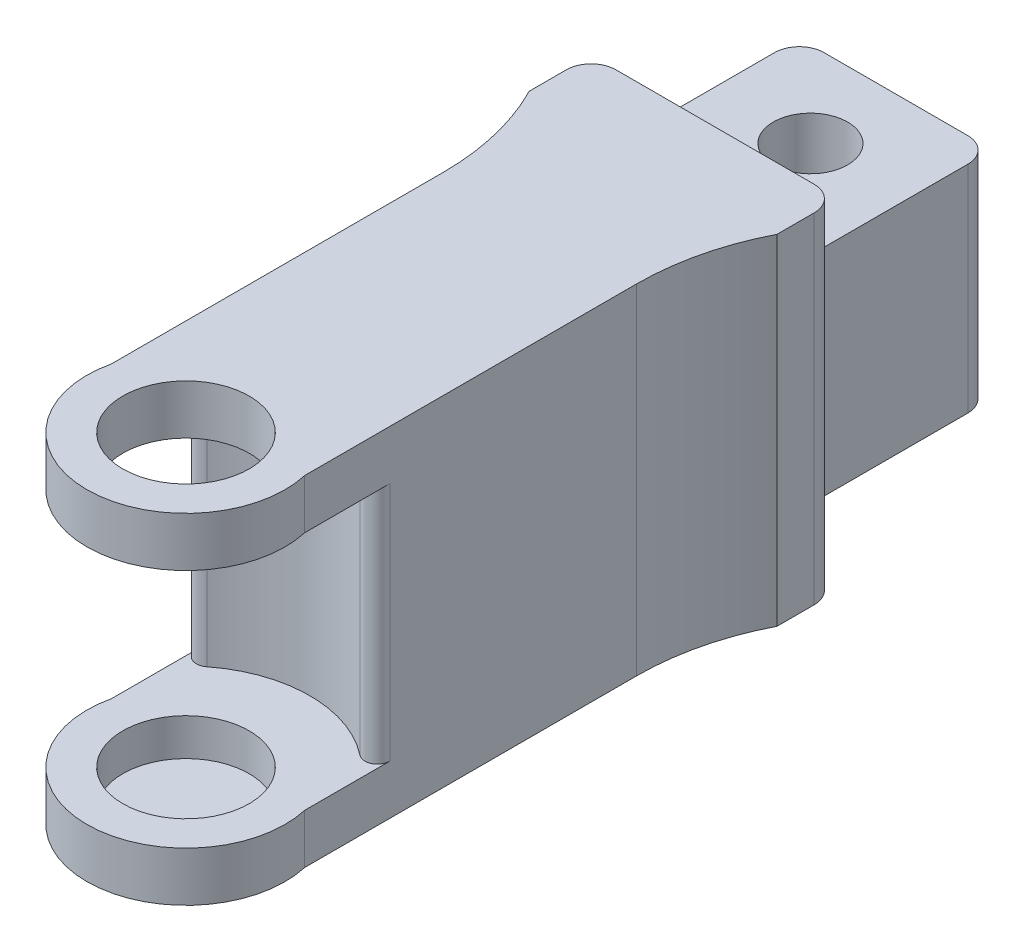
ISO-10303-21;
HEADER;
FILE_DESCRIPTION(('STEP AP214'),'2;1');
FILE_NAME('part.step','',(''),(''),'','','');
FILE_SCHEMA(('AUTOMOTIVE_DESIGN { 1 0 10303 214 1 1 1 1 }'));
ENDSEC;
DATA;
#1=APPLICATION_CONTEXT('core data for automotive mechanical design processes');
#2=APPLICATION_PROTOCOL_DEFINITION('international standard','automotive_design',2000,#1);
#3=PRODUCT_CONTEXT('',#1,'mechanical');
#4=PRODUCT('Part','Part','',(#3));
#5=PRODUCT_RELATED_PRODUCT_CATEGORY('part','',(#4));
#6=PRODUCT_DEFINITION_FORMATION('','',#4);
#7=PRODUCT_DEFINITION_CONTEXT('part definition',#1,'design');
#8=PRODUCT_DEFINITION('design','',#6,#7);
#9=PRODUCT_DEFINITION_SHAPE('','',#8);
#10=(LENGTH_UNIT() NAMED_UNIT(*) SI_UNIT(.MILLI.,.METRE.));
#11=(NAMED_UNIT(*) PLANE_ANGLE_UNIT() SI_UNIT($,.RADIAN.));
#12=(NAMED_UNIT(*) SI_UNIT($,.STERADIAN.) SOLID_ANGLE_UNIT());
#13=UNCERTAINTY_MEASURE_WITH_UNIT(LENGTH_MEASURE(1.E-05),#10,'distance_accuracy_value','');
#14=(GEOMETRIC_REPRESENTATION_CONTEXT(3) GLOBAL_UNCERTAINTY_ASSIGNED_CONTEXT((#13)) GLOBAL_UNIT_ASSIGNED_CONTEXT((#10,
#11,#12)) REPRESENTATION_CONTEXT('',''));
#15=CARTESIAN_POINT('',(0.,0.,0.));
#16=DIRECTION('',(0.,0.,1.));
#17=DIRECTION('',(1.,0.,0.));
#18=AXIS2_PLACEMENT_3D('',#15,#16,#17);
#19=CARTESIAN_POINT('',(-3.9,8.7,0.));
#20=DIRECTION('',(1.,0.,0.));
#21=DIRECTION('',(0.,0.,-1.));
#22=AXIS2_PLACEMENT_3D('',#19,#20,#21);
#23=PLANE('',#22);
#24=DIRECTION('',(0.,0.,1.));
#25=VECTOR('',#24,1.);
#26=CARTESIAN_POINT('',(-3.9,-0.5,0.));
#27=LINE('',#26,#25);
#28=CARTESIAN_POINT('',(-3.9,-0.5,20.6768067357565));
#29=VERTEX_POINT('',#28);
#30=CARTESIAN_POINT('',(-3.9,-0.5,24.1111805582684));
#31=VERTEX_POINT('',#30);
#32=EDGE_CURVE('E220',#29,#31,#27,.T.);
#33=ORIENTED_EDGE('',*,*,#32,.F.);
#34=DIRECTION('',(0.,1.,0.));
#35=VECTOR('',#34,1.);
#36=CARTESIAN_POINT('',(-3.9,9.2,20.6768067357565));
#37=LINE('',#36,#35);
#38=CARTESIAN_POINT('',(-3.9,9.2,20.6768067357565));
#39=VERTEX_POINT('',#38);
#40=EDGE_CURVE('E325',#29,#39,#37,.T.);
#41=ORIENTED_EDGE('',*,*,#40,.T.);
#42=DIRECTION('',(0.,0.,1.));
#43=VECTOR('',#42,1.);
#44=CARTESIAN_POINT('',(-3.9,9.2,0.));
#45=LINE('',#44,#43);
#46=CARTESIAN_POINT('',(-3.9,9.2,24.1111805582684));
#47=VERTEX_POINT('',#46);
#48=EDGE_CURVE('E397',#39,#47,#45,.T.);
#49=ORIENTED_EDGE('',*,*,#48,.T.);
#50=DIRECTION('',(0.,-1.,0.));
#51=VECTOR('',#50,1.);
#52=CARTESIAN_POINT('',(-3.9,11.2,24.1111805582684));
#53=LINE('',#52,#51);
#54=CARTESIAN_POINT('',(-3.9,11.2,24.1111805582684));
#55=VERTEX_POINT('',#54);
#56=EDGE_CURVE('E271',#55,#47,#53,.T.);
#57=ORIENTED_EDGE('',*,*,#56,.F.);
#58=DIRECTION('',(0.,0.,1.));
#59=VECTOR('',#58,1.);
#60=CARTESIAN_POINT('',(-3.9,11.2,0.));
#61=LINE('',#60,#59);
#62=CARTESIAN_POINT('',(-3.9,11.2,10.7096052460712));
#63=VERTEX_POINT('',#62);
#64=EDGE_CURVE('E252',#63,#55,#61,.T.);
#65=ORIENTED_EDGE('',*,*,#64,.F.);
#66=DIRECTION('',(0.,1.,0.));
#67=VECTOR('',#66,1.);
#68=CARTESIAN_POINT('',(-3.9,8.7,10.7096052460712));
#69=LINE('',#68,#67);
#70=CARTESIAN_POINT('',(-3.9,-2.5,10.7096052460712));
#71=VERTEX_POINT('',#70);
#72=EDGE_CURVE('E305',#63,#71,#69,.F.);
#73=ORIENTED_EDGE('',*,*,#72,.T.);
#74=DIRECTION('',(0.,0.,1.));
#75=VECTOR('',#74,1.);
#76=CARTESIAN_POINT('',(-3.9,-2.5,0.));
#77=LINE('',#76,#75);
#78=CARTESIAN_POINT('',(-3.9,-2.5,24.1111805582684));
#79=VERTEX_POINT('',#78);
#80=EDGE_CURVE('E395',#71,#79,#77,.T.);
#81=ORIENTED_EDGE('',*,*,#80,.T.);
#82=DIRECTION('',(0.,1.,0.));
#83=VECTOR('',#82,1.);
#84=CARTESIAN_POINT('',(-3.9,-2.5,24.1111805582684));
#85=LINE('',#84,#83);
#86=EDGE_CURVE('E241',#79,#31,#85,.T.);
#87=ORIENTED_EDGE('',*,*,#86,.T.);
#88=EDGE_LOOP('',(#33,#41,#49,#57,#65,#73,#81,#87));
#89=FACE_BOUND('',#88,.T.);
#90=ADVANCED_FACE('F65',(#89),#23,.F.);
#91=CARTESIAN_POINT('',(3.9,8.7,0.));
#92=DIRECTION('',(1.,0.,0.));
#93=DIRECTION('',(0.,0.,-1.));
#94=AXIS2_PLACEMENT_3D('',#91,#92,#93);
#95=PLANE('',#94);
#96=DIRECTION('',(0.,-1.,0.));
#97=VECTOR('',#96,1.);
#98=CARTESIAN_POINT('',(3.9,8.7,20.6768067357565));
#99=LINE('',#98,#97);
#100=CARTESIAN_POINT('',(3.9,9.2,20.6768067357565));
#101=VERTEX_POINT('',#100);
#102=CARTESIAN_POINT('',(3.9,-0.5,20.6768067357565));
#103=VERTEX_POINT('',#102);
#104=EDGE_CURVE('E235',#101,#103,#99,.T.);
#105=ORIENTED_EDGE('',*,*,#104,.T.);
#106=DIRECTION('',(0.,0.,1.));
#107=VECTOR('',#106,1.);
#108=CARTESIAN_POINT('',(3.9,-0.5,0.));
#109=LINE('',#108,#107);
#110=CARTESIAN_POINT('',(3.9,-0.5,24.1111805582685));
#111=VERTEX_POINT('',#110);
#112=EDGE_CURVE('E217',#103,#111,#109,.T.);
#113=ORIENTED_EDGE('',*,*,#112,.T.);
#114=DIRECTION('',(0.,1.,0.));
#115=VECTOR('',#114,1.);
#116=CARTESIAN_POINT('',(3.9,-2.5,24.1111805582685));
#117=LINE('',#116,#115);
#118=CARTESIAN_POINT('',(3.9,-2.5,24.1111805582685));
#119=VERTEX_POINT('',#118);
#120=EDGE_CURVE('E232',#119,#111,#117,.T.);
#121=ORIENTED_EDGE('',*,*,#120,.F.);
#122=DIRECTION('',(0.,0.,1.));
#123=VECTOR('',#122,1.);
#124=CARTESIAN_POINT('',(3.9,-2.5,0.));
#125=LINE('',#124,#123);
#126=CARTESIAN_POINT('',(3.9,-2.5,10.7096052460712));
#127=VERTEX_POINT('',#126);
#128=EDGE_CURVE('E390',#127,#119,#125,.T.);
#129=ORIENTED_EDGE('',*,*,#128,.F.);
#130=DIRECTION('',(0.,-1.,0.));
#131=VECTOR('',#130,1.);
#132=CARTESIAN_POINT('',(3.9,11.2,10.7096052460712));
#133=LINE('',#132,#131);
#134=CARTESIAN_POINT('',(3.9,11.2,10.7096052460712));
#135=VERTEX_POINT('',#134);
#136=EDGE_CURVE('E308',#127,#135,#133,.F.);
#137=ORIENTED_EDGE('',*,*,#136,.T.);
#138=DIRECTION('',(0.,0.,-1.));
#139=VECTOR('',#138,1.);
#140=CARTESIAN_POINT('',(3.9,11.2,0.));
#141=LINE('',#140,#139);
#142=CARTESIAN_POINT('',(3.9,11.2,24.1111805582684));
#143=VERTEX_POINT('',#142);
#144=EDGE_CURVE('E256',#143,#135,#141,.T.);
#145=ORIENTED_EDGE('',*,*,#144,.F.);
#146=DIRECTION('',(0.,-1.,0.));
#147=VECTOR('',#146,1.);
#148=CARTESIAN_POINT('',(3.9,11.2,24.1111805582684));
#149=LINE('',#148,#147);
#150=CARTESIAN_POINT('',(3.9,9.2,24.1111805582684));
#151=VERTEX_POINT('',#150);
#152=EDGE_CURVE('E264',#143,#151,#149,.T.);
#153=ORIENTED_EDGE('',*,*,#152,.T.);
#154=DIRECTION('',(0.,0.,1.));
#155=VECTOR('',#154,1.);
#156=CARTESIAN_POINT('',(3.9,9.2,0.));
#157=LINE('',#156,#155);
#158=EDGE_CURVE('E400',#101,#151,#157,.T.);
#159=ORIENTED_EDGE('',*,*,#158,.F.);
#160=EDGE_LOOP('',(#105,#113,#121,#129,#137,#145,#153,#159));
#161=FACE_BOUND('',#160,.T.);
#162=ADVANCED_FACE('F230',(#161),#95,.T.);
#163=CARTESIAN_POINT('',(0.,-2.5,25.));
#164=DIRECTION('',(0.,1.,0.));
#165=DIRECTION('',(0.,0.,1.));
#166=AXIS2_PLACEMENT_3D('',#163,#164,#165);
#167=CYLINDRICAL_SURFACE('',#166,4.);
#168=ORIENTED_EDGE('',*,*,#120,.T.);
#169=CARTESIAN_POINT('',(0.,-0.5,25.));
#170=DIRECTION('',(0.,1.,0.));
#171=DIRECTION('',(0.,0.,1.));
#172=AXIS2_PLACEMENT_3D('',#169,#170,#171);
#173=CIRCLE('',#172,4.);
#174=EDGE_CURVE('E214',#111,#31,#173,.F.);
#175=ORIENTED_EDGE('',*,*,#174,.T.);
#176=ORIENTED_EDGE('',*,*,#86,.F.);
#177=CARTESIAN_POINT('',(0.,-2.5,25.));
#178=DIRECTION('',(0.,1.,0.));
#179=DIRECTION('',(0.,0.,1.));
#180=AXIS2_PLACEMENT_3D('',#177,#178,#179);
#181=CIRCLE('',#180,4.);
#182=EDGE_CURVE('E239',#79,#119,#181,.T.);
#183=ORIENTED_EDGE('',*,*,#182,.T.);
#184=EDGE_LOOP('',(#168,#175,#176,#183));
#185=FACE_BOUND('',#184,.T.);
#186=ADVANCED_FACE('F237',(#185),#167,.T.);
#187=CARTESIAN_POINT('',(0.,-2.5,25.));
#188=DIRECTION('',(0.,1.,0.));
#189=DIRECTION('',(0.,0.,1.));
#190=AXIS2_PLACEMENT_3D('',#187,#188,#189);
#191=CYLINDRICAL_SURFACE('',#190,2.55);
#192=CARTESIAN_POINT('',(0.,-2.,25.));
#193=DIRECTION('',(0.,1.,0.));
#194=DIRECTION('',(0.,0.,1.));
#195=AXIS2_PLACEMENT_3D('',#192,#193,#194);
#196=CIRCLE('',#195,2.55);
#197=CARTESIAN_POINT('',(0.,-2.,27.55));
#198=VERTEX_POINT('',#197);
#199=EDGE_CURVE('E410',#198,#198,#196,.T.);
#200=ORIENTED_EDGE('',*,*,#199,.F.);
#201=EDGE_LOOP('',(#200));
#202=FACE_BOUND('',#201,.T.);
#203=CARTESIAN_POINT('',(0.,-0.5,25.));
#204=DIRECTION('',(0.,1.,0.));
#205=DIRECTION('',(0.,0.,1.));
#206=AXIS2_PLACEMENT_3D('',#203,#204,#205);
#207=CIRCLE('',#206,2.55);
#208=CARTESIAN_POINT('',(0.,-0.5,27.55));
#209=VERTEX_POINT('',#208);
#210=EDGE_CURVE('E413',#209,#209,#207,.T.);
#211=ORIENTED_EDGE('',*,*,#210,.T.);
#212=EDGE_LOOP('',(#211));
#213=FACE_BOUND('',#212,.T.);
#214=ADVANCED_FACE('F423',(#202,#213),#191,.F.);
#215=CARTESIAN_POINT('',(0.,0.,0.));
#216=DIRECTION('',(0.,1.,0.));
#217=DIRECTION('',(0.,0.,1.));
#218=AXIS2_PLACEMENT_3D('',#215,#216,#217);
#219=PLANE('',#218);
#220=CARTESIAN_POINT('',(0.,0.,-0.200000000000001));
#221=DIRECTION('',(0.,1.,0.));
#222=DIRECTION('',(0.,0.,1.));
#223=AXIS2_PLACEMENT_3D('',#220,#221,#222);
#224=CIRCLE('',#223,1.5);
#225=CARTESIAN_POINT('',(0.,0.,1.3));
#226=VERTEX_POINT('',#225);
#227=EDGE_CURVE('E274',#226,#226,#224,.T.);
#228=ORIENTED_EDGE('',*,*,#227,.T.);
#229=EDGE_LOOP('',(#228));
#230=FACE_BOUND('',#229,.T.);
#231=DIRECTION('',(1.,0.,0.));
#232=VECTOR('',#231,1.);
#233=CARTESIAN_POINT('',(0.,0.,-3.65));
#234=LINE('',#233,#232);
#235=CARTESIAN_POINT('',(-2.9,0.,-3.65));
#236=VERTEX_POINT('',#235);
#237=CARTESIAN_POINT('',(2.9,0.,-3.65));
#238=VERTEX_POINT('',#237);
#239=EDGE_CURVE('E291',#236,#238,#234,.T.);
#240=ORIENTED_EDGE('',*,*,#239,.T.);
#241=CARTESIAN_POINT('',(2.9,0.,-2.65));
#242=DIRECTION('',(0.,1.,0.));
#243=DIRECTION('',(0.,0.,1.));
#244=AXIS2_PLACEMENT_3D('',#241,#242,#243);
#245=CIRCLE('',#244,1.);
#246=CARTESIAN_POINT('',(3.9,0.,-2.65));
#247=VERTEX_POINT('',#246);
#248=EDGE_CURVE('E344',#238,#247,#245,.F.);
#249=ORIENTED_EDGE('',*,*,#248,.T.);
#250=DIRECTION('',(0.,0.,1.));
#251=VECTOR('',#250,1.);
#252=CARTESIAN_POINT('',(3.9,0.,0.));
#253=LINE('',#252,#251);
#254=CARTESIAN_POINT('',(3.9,0.,3.65));
#255=VERTEX_POINT('',#254);
#256=EDGE_CURVE('E289',#247,#255,#253,.T.);
#257=ORIENTED_EDGE('',*,*,#256,.T.);
#258=DIRECTION('',(1.,0.,0.));
#259=VECTOR('',#258,1.);
#260=CARTESIAN_POINT('',(0.,0.,3.65));
#261=LINE('',#260,#259);
#262=CARTESIAN_POINT('',(-3.9,0.,3.65));
#263=VERTEX_POINT('',#262);
#264=EDGE_CURVE('E248',#263,#255,#261,.T.);
#265=ORIENTED_EDGE('',*,*,#264,.F.);
#266=DIRECTION('',(0.,0.,1.));
#267=VECTOR('',#266,1.);
#268=CARTESIAN_POINT('',(-3.9,0.,0.));
#269=LINE('',#268,#267);
#270=CARTESIAN_POINT('',(-3.9,0.,-2.65));
#271=VERTEX_POINT('',#270);
#272=EDGE_CURVE('E279',#271,#263,#269,.T.);
#273=ORIENTED_EDGE('',*,*,#272,.F.);
#274=CARTESIAN_POINT('',(-2.9,0.,-2.65));
#275=DIRECTION('',(0.,1.,0.));
#276=DIRECTION('',(0.,0.,1.));
#277=AXIS2_PLACEMENT_3D('',#274,#275,#276);
#278=CIRCLE('',#277,1.);
#279=EDGE_CURVE('E342',#271,#236,#278,.F.);
#280=ORIENTED_EDGE('',*,*,#279,.T.);
#281=EDGE_LOOP('',(#240,#249,#257,#265,#273,#280));
#282=FACE_BOUND('',#281,.T.);
#283=ADVANCED_FACE('F426',(#230,#282),#219,.F.);
#284=CARTESIAN_POINT('',(0.,8.7,0.));
#285=DIRECTION('',(0.,1.,0.));
#286=DIRECTION('',(0.,0.,1.));
#287=AXIS2_PLACEMENT_3D('',#284,#285,#286);
#288=PLANE('',#287);
#289=CARTESIAN_POINT('',(0.,8.7,-0.200000000000001));
#290=DIRECTION('',(0.,1.,0.));
#291=DIRECTION('',(0.,0.,1.));
#292=AXIS2_PLACEMENT_3D('',#289,#290,#291);
#293=CIRCLE('',#292,1.5);
#294=CARTESIAN_POINT('',(0.,8.7,1.3));
#295=VERTEX_POINT('',#294);
#296=EDGE_CURVE('E275',#295,#295,#293,.T.);
#297=ORIENTED_EDGE('',*,*,#296,.F.);
#298=EDGE_LOOP('',(#297));
#299=FACE_BOUND('',#298,.T.);
#300=DIRECTION('',(0.,0.,1.));
#301=VECTOR('',#300,1.);
#302=CARTESIAN_POINT('',(3.9,8.7,0.));
#303=LINE('',#302,#301);
#304=CARTESIAN_POINT('',(3.9,8.7,-2.65));
#305=VERTEX_POINT('',#304);
#306=CARTESIAN_POINT('',(3.9,8.7,3.65));
#307=VERTEX_POINT('',#306);
#308=EDGE_CURVE('E278',#305,#307,#303,.T.);
#309=ORIENTED_EDGE('',*,*,#308,.F.);
#310=CARTESIAN_POINT('',(2.9,8.7,-2.65));
#311=DIRECTION('',(0.,1.,0.));
#312=DIRECTION('',(0.,0.,1.));
#313=AXIS2_PLACEMENT_3D('',#310,#311,#312);
#314=CIRCLE('',#313,1.);
#315=CARTESIAN_POINT('',(2.9,8.7,-3.65));
#316=VERTEX_POINT('',#315);
#317=EDGE_CURVE('E350',#305,#316,#314,.T.);
#318=ORIENTED_EDGE('',*,*,#317,.T.);
#319=DIRECTION('',(1.,0.,0.));
#320=VECTOR('',#319,1.);
#321=CARTESIAN_POINT('',(0.,8.7,-3.65));
#322=LINE('',#321,#320);
#323=CARTESIAN_POINT('',(-2.9,8.7,-3.65));
#324=VERTEX_POINT('',#323);
#325=EDGE_CURVE('E281',#324,#316,#322,.T.);
#326=ORIENTED_EDGE('',*,*,#325,.F.);
#327=CARTESIAN_POINT('',(-2.9,8.7,-2.65));
#328=DIRECTION('',(0.,1.,0.));
#329=DIRECTION('',(0.,0.,1.));
#330=AXIS2_PLACEMENT_3D('',#327,#328,#329);
#331=CIRCLE('',#330,1.);
#332=CARTESIAN_POINT('',(-3.9,8.7,-2.65));
#333=VERTEX_POINT('',#332);
#334=EDGE_CURVE('E348',#324,#333,#331,.T.);
#335=ORIENTED_EDGE('',*,*,#334,.T.);
#336=DIRECTION('',(0.,0.,1.));
#337=VECTOR('',#336,1.);
#338=CARTESIAN_POINT('',(-3.9,8.7,0.));
#339=LINE('',#338,#337);
#340=CARTESIAN_POINT('',(-3.9,8.7,3.65));
#341=VERTEX_POINT('',#340);
#342=EDGE_CURVE('E284',#333,#341,#339,.T.);
#343=ORIENTED_EDGE('',*,*,#342,.T.);
#344=DIRECTION('',(1.,0.,0.));
#345=VECTOR('',#344,1.);
#346=CARTESIAN_POINT('',(0.,8.7,3.65));
#347=LINE('',#346,#345);
#348=EDGE_CURVE('E265',#341,#307,#347,.T.);
#349=ORIENTED_EDGE('',*,*,#348,.T.);
#350=EDGE_LOOP('',(#309,#318,#326,#335,#343,#349));
#351=FACE_BOUND('',#350,.T.);
#352=ADVANCED_FACE('F464',(#299,#351),#288,.T.);
#353=CARTESIAN_POINT('',(3.9,8.7,0.));
#354=DIRECTION('',(1.,0.,0.));
#355=DIRECTION('',(0.,0.,-1.));
#356=AXIS2_PLACEMENT_3D('',#353,#354,#355);
#357=PLANE('',#356);
#358=ORIENTED_EDGE('',*,*,#256,.F.);
#359=DIRECTION('',(0.,-1.,0.));
#360=VECTOR('',#359,1.);
#361=CARTESIAN_POINT('',(3.9,8.7,-2.65));
#362=LINE('',#361,#360);
#363=EDGE_CURVE('E346',#247,#305,#362,.F.);
#364=ORIENTED_EDGE('',*,*,#363,.T.);
#365=ORIENTED_EDGE('',*,*,#308,.T.);
#366=DIRECTION('',(0.,-1.,0.));
#367=VECTOR('',#366,1.);
#368=CARTESIAN_POINT('',(3.9,8.7,3.65));
#369=LINE('',#368,#367);
#370=EDGE_CURVE('E286',#307,#255,#369,.T.);
#371=ORIENTED_EDGE('',*,*,#370,.T.);
#372=EDGE_LOOP('',(#358,#364,#365,#371));
#373=FACE_BOUND('',#372,.T.);
#374=ADVANCED_FACE('F460',(#373),#357,.T.);
#375=CARTESIAN_POINT('',(0.,8.7,-3.65));
#376=DIRECTION('',(0.,0.,-1.));
#377=DIRECTION('',(-1.,0.,0.));
#378=AXIS2_PLACEMENT_3D('',#375,#376,#377);
#379=PLANE('',#378);
#380=ORIENTED_EDGE('',*,*,#325,.T.);
#381=DIRECTION('',(0.,-1.,0.));
#382=VECTOR('',#381,1.);
#383=CARTESIAN_POINT('',(2.9,8.7,-3.65));
#384=LINE('',#383,#382);
#385=EDGE_CURVE('E339',#316,#238,#384,.T.);
#386=ORIENTED_EDGE('',*,*,#385,.T.);
#387=ORIENTED_EDGE('',*,*,#239,.F.);
#388=DIRECTION('',(0.,-1.,0.));
#389=VECTOR('',#388,1.);
#390=CARTESIAN_POINT('',(-2.9,8.7,-3.65));
#391=LINE('',#390,#389);
#392=EDGE_CURVE('E337',#236,#324,#391,.F.);
#393=ORIENTED_EDGE('',*,*,#392,.T.);
#394=EDGE_LOOP('',(#380,#386,#387,#393));
#395=FACE_BOUND('',#394,.T.);
#396=ADVANCED_FACE('F456',(#395),#379,.T.);
#397=CARTESIAN_POINT('',(-3.9,8.7,0.));
#398=DIRECTION('',(1.,0.,0.));
#399=DIRECTION('',(0.,0.,-1.));
#400=AXIS2_PLACEMENT_3D('',#397,#398,#399);
#401=PLANE('',#400);
#402=ORIENTED_EDGE('',*,*,#342,.F.);
#403=DIRECTION('',(0.,-1.,0.));
#404=VECTOR('',#403,1.);
#405=CARTESIAN_POINT('',(-3.9,0.,-2.65));
#406=LINE('',#405,#404);
#407=EDGE_CURVE('E352',#333,#271,#406,.T.);
#408=ORIENTED_EDGE('',*,*,#407,.T.);
#409=ORIENTED_EDGE('',*,*,#272,.T.);
#410=DIRECTION('',(0.,-1.,0.));
#411=VECTOR('',#410,1.);
#412=CARTESIAN_POINT('',(-3.9,8.7,3.65));
#413=LINE('',#412,#411);
#414=EDGE_CURVE('E268',#341,#263,#413,.T.);
#415=ORIENTED_EDGE('',*,*,#414,.F.);
#416=EDGE_LOOP('',(#402,#408,#409,#415));
#417=FACE_BOUND('',#416,.T.);
#418=ADVANCED_FACE('F453',(#417),#401,.F.);
#419=CARTESIAN_POINT('',(-5.,8.7,0.));
#420=DIRECTION('',(-1.,0.,0.));
#421=DIRECTION('',(0.,0.,1.));
#422=AXIS2_PLACEMENT_3D('',#419,#420,#421);
#423=PLANE('',#422);
#424=DIRECTION('',(0.,0.,1.));
#425=VECTOR('',#424,1.);
#426=CARTESIAN_POINT('',(-5.,11.2,0.));
#427=LINE('',#426,#425);
#428=CARTESIAN_POINT('',(-5.,11.2,4.65));
#429=VERTEX_POINT('',#428);
#430=CARTESIAN_POINT('',(-5.,11.2,6.15));
#431=VERTEX_POINT('',#430);
#432=EDGE_CURVE('E243',#429,#431,#427,.T.);
#433=ORIENTED_EDGE('',*,*,#432,.F.);
#434=DIRECTION('',(0.,-1.,0.));
#435=VECTOR('',#434,1.);
#436=CARTESIAN_POINT('',(-5.,8.7,4.65));
#437=LINE('',#436,#435);
#438=CARTESIAN_POINT('',(-5.,-2.5,4.65));
#439=VERTEX_POINT('',#438);
#440=EDGE_CURVE('E355',#429,#439,#437,.T.);
#441=ORIENTED_EDGE('',*,*,#440,.T.);
#442=DIRECTION('',(0.,0.,1.));
#443=VECTOR('',#442,1.);
#444=CARTESIAN_POINT('',(-5.,-2.5,0.));
#445=LINE('',#444,#443);
#446=CARTESIAN_POINT('',(-5.,-2.5,6.15));
#447=VERTEX_POINT('',#446);
#448=EDGE_CURVE('E245',#439,#447,#445,.T.);
#449=ORIENTED_EDGE('',*,*,#448,.T.);
#450=DIRECTION('',(0.,-1.,0.));
#451=VECTOR('',#450,1.);
#452=CARTESIAN_POINT('',(-5.,8.7,6.15));
#453=LINE('',#452,#451);
#454=EDGE_CURVE('E300',#431,#447,#453,.T.);
#455=ORIENTED_EDGE('',*,*,#454,.F.);
#456=EDGE_LOOP('',(#433,#441,#449,#455));
#457=FACE_BOUND('',#456,.T.);
#458=ADVANCED_FACE('F376',(#457),#423,.T.);
#459=CARTESIAN_POINT('',(0.,8.7,25.));
#460=DIRECTION('',(0.,-1.,0.));
#461=DIRECTION('',(0.,0.,-1.));
#462=AXIS2_PLACEMENT_3D('',#459,#460,#461);
#463=CYLINDRICAL_SURFACE('',#462,5.);
#464=CARTESIAN_POINT('',(0.,-0.5,25.));
#465=DIRECTION('',(0.,1.,0.));
#466=DIRECTION('',(0.,0.,1.));
#467=AXIS2_PLACEMENT_3D('',#464,#465,#466);
#468=CIRCLE('',#467,5.);
#469=CARTESIAN_POINT('',(3.09090909090909,-0.5,21.0698243052332));
#470=VERTEX_POINT('',#469);
#471=CARTESIAN_POINT('',(-3.09090909090909,-0.5,21.0698243052332));
#472=VERTEX_POINT('',#471);
#473=EDGE_CURVE('E409',#470,#472,#468,.T.);
#474=ORIENTED_EDGE('',*,*,#473,.F.);
#475=DIRECTION('',(0.,-1.,0.));
#476=VECTOR('',#475,1.);
#477=CARTESIAN_POINT('',(3.09090909090909,8.7,21.0698243052332));
#478=LINE('',#477,#476);
#479=CARTESIAN_POINT('',(3.09090909090909,9.2,21.0698243052332));
#480=VERTEX_POINT('',#479);
#481=EDGE_CURVE('E323',#470,#480,#478,.F.);
#482=ORIENTED_EDGE('',*,*,#481,.T.);
#483=CARTESIAN_POINT('',(0.,9.2,25.));
#484=DIRECTION('',(0.,1.,0.));
#485=DIRECTION('',(0.,0.,1.));
#486=AXIS2_PLACEMENT_3D('',#483,#484,#485);
#487=CIRCLE('',#486,5.);
#488=CARTESIAN_POINT('',(-3.09090909090909,9.2,21.0698243052332));
#489=VERTEX_POINT('',#488);
#490=EDGE_CURVE('E225',#480,#489,#487,.T.);
#491=ORIENTED_EDGE('',*,*,#490,.T.);
#492=DIRECTION('',(0.,-1.,0.));
#493=VECTOR('',#492,1.);
#494=CARTESIAN_POINT('',(-3.09090909090909,8.7,21.0698243052332));
#495=LINE('',#494,#493);
#496=EDGE_CURVE('E320',#489,#472,#495,.T.);
#497=ORIENTED_EDGE('',*,*,#496,.T.);
#498=EDGE_LOOP('',(#474,#482,#491,#497));
#499=FACE_BOUND('',#498,.T.);
#500=ADVANCED_FACE('F450',(#499),#463,.F.);
#501=CARTESIAN_POINT('',(5.,8.7,0.));
#502=DIRECTION('',(-1.,0.,0.));
#503=DIRECTION('',(0.,0.,1.));
#504=AXIS2_PLACEMENT_3D('',#501,#502,#503);
#505=PLANE('',#504);
#506=DIRECTION('',(0.,0.,-1.));
#507=VECTOR('',#506,1.);
#508=CARTESIAN_POINT('',(5.,-2.5,0.));
#509=LINE('',#508,#507);
#510=CARTESIAN_POINT('',(5.,-2.5,6.15));
#511=VERTEX_POINT('',#510);
#512=CARTESIAN_POINT('',(5.,-2.5,4.65));
#513=VERTEX_POINT('',#512);
#514=EDGE_CURVE('E388',#511,#513,#509,.T.);
#515=ORIENTED_EDGE('',*,*,#514,.T.);
#516=DIRECTION('',(0.,-1.,0.));
#517=VECTOR('',#516,1.);
#518=CARTESIAN_POINT('',(5.,11.2,4.65));
#519=LINE('',#518,#517);
#520=CARTESIAN_POINT('',(5.,11.2,4.65));
#521=VERTEX_POINT('',#520);
#522=EDGE_CURVE('E14',#513,#521,#519,.F.);
#523=ORIENTED_EDGE('',*,*,#522,.T.);
#524=DIRECTION('',(0.,0.,-1.));
#525=VECTOR('',#524,1.);
#526=CARTESIAN_POINT('',(5.,11.2,0.));
#527=LINE('',#526,#525);
#528=CARTESIAN_POINT('',(5.,11.2,6.15));
#529=VERTEX_POINT('',#528);
#530=EDGE_CURVE('E259',#529,#521,#527,.T.);
#531=ORIENTED_EDGE('',*,*,#530,.F.);
#532=DIRECTION('',(0.,-1.,0.));
#533=VECTOR('',#532,1.);
#534=CARTESIAN_POINT('',(5.,8.7,6.15));
#535=LINE('',#534,#533);
#536=EDGE_CURVE('E297',#529,#511,#535,.T.);
#537=ORIENTED_EDGE('',*,*,#536,.T.);
#538=EDGE_LOOP('',(#515,#523,#531,#537));
#539=FACE_BOUND('',#538,.T.);
#540=ADVANCED_FACE('F469',(#539),#505,.F.);
#541=CARTESIAN_POINT('',(0.,8.7,-0.200000000000001));
#542=DIRECTION('',(0.,-1.,0.));
#543=DIRECTION('',(0.,0.,-1.));
#544=AXIS2_PLACEMENT_3D('',#541,#542,#543);
#545=CYLINDRICAL_SURFACE('',#544,1.5);
#546=ORIENTED_EDGE('',*,*,#296,.T.);
#547=EDGE_LOOP('',(#546));
#548=FACE_BOUND('',#547,.T.);
#549=ORIENTED_EDGE('',*,*,#227,.F.);
#550=EDGE_LOOP('',(#549));
#551=FACE_BOUND('',#550,.T.);
#552=ADVANCED_FACE('F466',(#548,#551),#545,.F.);
#553=CARTESIAN_POINT('',(0.,8.7,3.65));
#554=DIRECTION('',(0.,0.,-1.));
#555=DIRECTION('',(-1.,0.,0.));
#556=AXIS2_PLACEMENT_3D('',#553,#554,#555);
#557=PLANE('',#556);
#558=ORIENTED_EDGE('',*,*,#414,.T.);
#559=ORIENTED_EDGE('',*,*,#264,.T.);
#560=ORIENTED_EDGE('',*,*,#370,.F.);
#561=ORIENTED_EDGE('',*,*,#348,.F.);
#562=EDGE_LOOP('',(#558,#559,#560,#561));
#563=FACE_BOUND('',#562,.T.);
#564=DIRECTION('',(1.,0.,0.));
#565=VECTOR('',#564,1.);
#566=CARTESIAN_POINT('',(0.,-2.5,3.65));
#567=LINE('',#566,#565);
#568=CARTESIAN_POINT('',(-4.,-2.5,3.65));
#569=VERTEX_POINT('',#568);
#570=CARTESIAN_POINT('',(4.,-2.5,3.65));
#571=VERTEX_POINT('',#570);
#572=EDGE_CURVE('E384',#569,#571,#567,.T.);
#573=ORIENTED_EDGE('',*,*,#572,.F.);
#574=DIRECTION('',(0.,-1.,0.));
#575=VECTOR('',#574,1.);
#576=CARTESIAN_POINT('',(-4.,8.7,3.65));
#577=LINE('',#576,#575);
#578=CARTESIAN_POINT('',(-4.,11.2,3.65));
#579=VERTEX_POINT('',#578);
#580=EDGE_CURVE('E365',#569,#579,#577,.F.);
#581=ORIENTED_EDGE('',*,*,#580,.T.);
#582=DIRECTION('',(1.,0.,0.));
#583=VECTOR('',#582,1.);
#584=CARTESIAN_POINT('',(0.,11.2,3.65));
#585=LINE('',#584,#583);
#586=CARTESIAN_POINT('',(4.,11.2,3.65));
#587=VERTEX_POINT('',#586);
#588=EDGE_CURVE('E240',#579,#587,#585,.T.);
#589=ORIENTED_EDGE('',*,*,#588,.T.);
#590=DIRECTION('',(0.,-1.,0.));
#591=VECTOR('',#590,1.);
#592=CARTESIAN_POINT('',(4.,-2.5,3.65));
#593=LINE('',#592,#591);
#594=EDGE_CURVE('E362',#587,#571,#593,.T.);
#595=ORIENTED_EDGE('',*,*,#594,.T.);
#596=EDGE_LOOP('',(#573,#581,#589,#595));
#597=FACE_BOUND('',#596,.T.);
#598=ADVANCED_FACE('F386',(#563,#597),#557,.T.);
#599=CARTESIAN_POINT('',(0.,11.2,25.));
#600=DIRECTION('',(0.,-1.,0.));
#601=DIRECTION('',(0.,0.,-1.));
#602=AXIS2_PLACEMENT_3D('',#599,#600,#601);
#603=CYLINDRICAL_SURFACE('',#602,4.);
#604=ORIENTED_EDGE('',*,*,#56,.T.);
#605=CARTESIAN_POINT('',(0.,9.2,25.));
#606=DIRECTION('',(0.,1.,0.));
#607=DIRECTION('',(0.,0.,1.));
#608=AXIS2_PLACEMENT_3D('',#605,#606,#607);
#609=CIRCLE('',#608,4.);
#610=EDGE_CURVE('E402',#47,#151,#609,.T.);
#611=ORIENTED_EDGE('',*,*,#610,.T.);
#612=ORIENTED_EDGE('',*,*,#152,.F.);
#613=CARTESIAN_POINT('',(0.,11.2,25.));
#614=DIRECTION('',(0.,1.,0.));
#615=DIRECTION('',(0.,0.,1.));
#616=AXIS2_PLACEMENT_3D('',#613,#614,#615);
#617=CIRCLE('',#616,4.);
#618=EDGE_CURVE('E254',#55,#143,#617,.T.);
#619=ORIENTED_EDGE('',*,*,#618,.F.);
#620=EDGE_LOOP('',(#604,#611,#612,#619));
#621=FACE_BOUND('',#620,.T.);
#622=ADVANCED_FACE('F511',(#621),#603,.T.);
#623=CARTESIAN_POINT('',(0.,11.2,25.));
#624=DIRECTION('',(0.,-1.,0.));
#625=DIRECTION('',(0.,0.,-1.));
#626=AXIS2_PLACEMENT_3D('',#623,#624,#625);
#627=CYLINDRICAL_SURFACE('',#626,2.55);
#628=CARTESIAN_POINT('',(0.,9.2,25.));
#629=DIRECTION('',(0.,1.,0.));
#630=DIRECTION('',(0.,0.,1.));
#631=AXIS2_PLACEMENT_3D('',#628,#629,#630);
#632=CIRCLE('',#631,2.55);
#633=CARTESIAN_POINT('',(0.,9.2,27.55));
#634=VERTEX_POINT('',#633);
#635=EDGE_CURVE('E406',#634,#634,#632,.T.);
#636=ORIENTED_EDGE('',*,*,#635,.F.);
#637=EDGE_LOOP('',(#636));
#638=FACE_BOUND('',#637,.T.);
#639=CARTESIAN_POINT('',(0.,11.2,25.));
#640=DIRECTION('',(0.,1.,0.));
#641=DIRECTION('',(0.,0.,1.));
#642=AXIS2_PLACEMENT_3D('',#639,#640,#641);
#643=CIRCLE('',#642,2.55);
#644=CARTESIAN_POINT('',(0.,11.2,27.55));
#645=VERTEX_POINT('',#644);
#646=EDGE_CURVE('E261',#645,#645,#643,.T.);
#647=ORIENTED_EDGE('',*,*,#646,.T.);
#648=EDGE_LOOP('',(#647));
#649=FACE_BOUND('',#648,.T.);
#650=ADVANCED_FACE('F542',(#638,#649),#627,.F.);
#651=CARTESIAN_POINT('',(0.,11.2,0.));
#652=DIRECTION('',(0.,1.,0.));
#653=DIRECTION('',(0.,0.,1.));
#654=AXIS2_PLACEMENT_3D('',#651,#652,#653);
#655=PLANE('',#654);
#656=ORIENTED_EDGE('',*,*,#588,.F.);
#657=CARTESIAN_POINT('',(-4.,11.2,4.65));
#658=DIRECTION('',(0.,1.,0.));
#659=DIRECTION('',(0.,0.,1.));
#660=AXIS2_PLACEMENT_3D('',#657,#658,#659);
#661=CIRCLE('',#660,1.);
#662=EDGE_CURVE('E73',#579,#429,#661,.T.);
#663=ORIENTED_EDGE('',*,*,#662,.T.);
#664=ORIENTED_EDGE('',*,*,#432,.T.);
#665=CARTESIAN_POINT('',(-13.9,11.2,10.7096052460712));
#666=DIRECTION('',(0.,1.,0.));
#667=DIRECTION('',(0.,0.,1.));
#668=AXIS2_PLACEMENT_3D('',#665,#666,#667);
#669=CIRCLE('',#668,10.);
#670=EDGE_CURVE('E313',#431,#63,#669,.F.);
#671=ORIENTED_EDGE('',*,*,#670,.T.);
#672=ORIENTED_EDGE('',*,*,#64,.T.);
#673=ORIENTED_EDGE('',*,*,#618,.T.);
#674=ORIENTED_EDGE('',*,*,#144,.T.);
#675=CARTESIAN_POINT('',(13.9,11.2,10.7096052460712));
#676=DIRECTION('',(0.,1.,0.));
#677=DIRECTION('',(0.,0.,1.));
#678=AXIS2_PLACEMENT_3D('',#675,#676,#677);
#679=CIRCLE('',#678,10.);
#680=EDGE_CURVE('E317',#135,#529,#679,.F.);
#681=ORIENTED_EDGE('',*,*,#680,.T.);
#682=ORIENTED_EDGE('',*,*,#530,.T.);
#683=CARTESIAN_POINT('',(4.,11.2,4.65));
#684=DIRECTION('',(0.,1.,0.));
#685=DIRECTION('',(0.,0.,1.));
#686=AXIS2_PLACEMENT_3D('',#683,#684,#685);
#687=CIRCLE('',#686,1.);
#688=EDGE_CURVE('E85',#521,#587,#687,.T.);
#689=ORIENTED_EDGE('',*,*,#688,.T.);
#690=EDGE_LOOP('',(#656,#663,#664,#671,#672,#673,#674,#681,#682,#689));
#691=FACE_BOUND('',#690,.T.);
#692=ORIENTED_EDGE('',*,*,#646,.F.);
#693=EDGE_LOOP('',(#692));
#694=FACE_BOUND('',#693,.T.);
#695=ADVANCED_FACE('F369',(#691,#694),#655,.T.);
#696=CARTESIAN_POINT('',(0.,-2.5,25.));
#697=DIRECTION('',(0.,1.,0.));
#698=DIRECTION('',(0.,0.,1.));
#699=AXIS2_PLACEMENT_3D('',#696,#697,#698);
#700=PLANE('',#699);
#701=ORIENTED_EDGE('',*,*,#448,.F.);
#702=CARTESIAN_POINT('',(-4.,-2.5,4.65));
#703=DIRECTION('',(0.,1.,0.));
#704=DIRECTION('',(0.,0.,1.));
#705=AXIS2_PLACEMENT_3D('',#702,#703,#704);
#706=CIRCLE('',#705,1.);
#707=EDGE_CURVE('E360',#439,#569,#706,.F.);
#708=ORIENTED_EDGE('',*,*,#707,.T.);
#709=ORIENTED_EDGE('',*,*,#572,.T.);
#710=CARTESIAN_POINT('',(4.,-2.5,4.65));
#711=DIRECTION('',(0.,1.,0.));
#712=DIRECTION('',(0.,0.,1.));
#713=AXIS2_PLACEMENT_3D('',#710,#711,#712);
#714=CIRCLE('',#713,1.);
#715=EDGE_CURVE('E358',#571,#513,#714,.F.);
#716=ORIENTED_EDGE('',*,*,#715,.T.);
#717=ORIENTED_EDGE('',*,*,#514,.F.);
#718=CARTESIAN_POINT('',(13.9,-2.5,10.7096052460712));
#719=DIRECTION('',(0.,1.,0.));
#720=DIRECTION('',(0.,0.,1.));
#721=AXIS2_PLACEMENT_3D('',#718,#719,#720);
#722=CIRCLE('',#721,10.);
#723=EDGE_CURVE('E315',#511,#127,#722,.T.);
#724=ORIENTED_EDGE('',*,*,#723,.T.);
#725=ORIENTED_EDGE('',*,*,#128,.T.);
#726=ORIENTED_EDGE('',*,*,#182,.F.);
#727=ORIENTED_EDGE('',*,*,#80,.F.);
#728=CARTESIAN_POINT('',(-13.9,-2.5,10.7096052460712));
#729=DIRECTION('',(0.,1.,0.));
#730=DIRECTION('',(0.,0.,1.));
#731=AXIS2_PLACEMENT_3D('',#728,#729,#730);
#732=CIRCLE('',#731,10.);
#733=EDGE_CURVE('E310',#71,#447,#732,.T.);
#734=ORIENTED_EDGE('',*,*,#733,.T.);
#735=EDGE_LOOP('',(#701,#708,#709,#716,#717,#724,#725,#726,#727,#734));
#736=FACE_BOUND('',#735,.T.);
#737=ADVANCED_FACE('F383',(#736),#700,.F.);
#738=CARTESIAN_POINT('',(0.,-0.5,0.));
#739=DIRECTION('',(0.,1.,0.));
#740=DIRECTION('',(0.,0.,1.));
#741=AXIS2_PLACEMENT_3D('',#738,#739,#740);
#742=PLANE('',#741);
#743=ORIENTED_EDGE('',*,*,#210,.F.);
#744=EDGE_LOOP('',(#743));
#745=FACE_BOUND('',#744,.T.);
#746=ORIENTED_EDGE('',*,*,#32,.T.);
#747=ORIENTED_EDGE('',*,*,#174,.F.);
#748=ORIENTED_EDGE('',*,*,#112,.F.);
#749=CARTESIAN_POINT('',(3.4,-0.5,20.6768067357565));
#750=DIRECTION('',(0.,1.,0.));
#751=DIRECTION('',(0.,0.,1.));
#752=AXIS2_PLACEMENT_3D('',#749,#750,#751);
#753=CIRCLE('',#752,0.5);
#754=EDGE_CURVE('E328',#103,#470,#753,.F.);
#755=ORIENTED_EDGE('',*,*,#754,.T.);
#756=ORIENTED_EDGE('',*,*,#473,.T.);
#757=CARTESIAN_POINT('',(-3.4,-0.5,20.6768067357565));
#758=DIRECTION('',(0.,1.,0.));
#759=DIRECTION('',(0.,0.,1.));
#760=AXIS2_PLACEMENT_3D('',#757,#758,#759);
#761=CIRCLE('',#760,0.5);
#762=EDGE_CURVE('E333',#472,#29,#761,.F.);
#763=ORIENTED_EDGE('',*,*,#762,.T.);
#764=EDGE_LOOP('',(#746,#747,#748,#755,#756,#763));
#765=FACE_BOUND('',#764,.T.);
#766=ADVANCED_FACE('F216',(#745,#765),#742,.T.);
#767=CARTESIAN_POINT('',(0.,9.2,0.));
#768=DIRECTION('',(0.,1.,0.));
#769=DIRECTION('',(0.,0.,1.));
#770=AXIS2_PLACEMENT_3D('',#767,#768,#769);
#771=PLANE('',#770);
#772=ORIENTED_EDGE('',*,*,#635,.T.);
#773=EDGE_LOOP('',(#772));
#774=FACE_BOUND('',#773,.T.);
#775=ORIENTED_EDGE('',*,*,#490,.F.);
#776=CARTESIAN_POINT('',(3.4,9.2,20.6768067357565));
#777=DIRECTION('',(0.,1.,0.));
#778=DIRECTION('',(0.,0.,1.));
#779=AXIS2_PLACEMENT_3D('',#776,#777,#778);
#780=CIRCLE('',#779,0.5);
#781=EDGE_CURVE('E330',#480,#101,#780,.T.);
#782=ORIENTED_EDGE('',*,*,#781,.T.);
#783=ORIENTED_EDGE('',*,*,#158,.T.);
#784=ORIENTED_EDGE('',*,*,#610,.F.);
#785=ORIENTED_EDGE('',*,*,#48,.F.);
#786=CARTESIAN_POINT('',(-3.4,9.2,20.6768067357565));
#787=DIRECTION('',(0.,1.,0.));
#788=DIRECTION('',(0.,0.,1.));
#789=AXIS2_PLACEMENT_3D('',#786,#787,#788);
#790=CIRCLE('',#789,0.5);
#791=EDGE_CURVE('E335',#39,#489,#790,.T.);
#792=ORIENTED_EDGE('',*,*,#791,.T.);
#793=EDGE_LOOP('',(#775,#782,#783,#784,#785,#792));
#794=FACE_BOUND('',#793,.T.);
#795=ADVANCED_FACE('F431',(#774,#794),#771,.F.);
#796=CARTESIAN_POINT('',(0.,-2.,25.));
#797=DIRECTION('',(0.,1.,0.));
#798=DIRECTION('',(0.,0.,1.));
#799=AXIS2_PLACEMENT_3D('',#796,#797,#798);
#800=PLANE('',#799);
#801=ORIENTED_EDGE('',*,*,#199,.T.);
#802=EDGE_LOOP('',(#801));
#803=FACE_BOUND('',#802,.T.);
#804=ADVANCED_FACE('F421',(#803),#800,.T.);
#805=CARTESIAN_POINT('',(-13.9,8.7,10.7096052460712));
#806=DIRECTION('',(0.,1.,0.));
#807=DIRECTION('',(0.,0.,1.));
#808=AXIS2_PLACEMENT_3D('',#805,#806,#807);
#809=CYLINDRICAL_SURFACE('',#808,10.);
#810=ORIENTED_EDGE('',*,*,#670,.F.);
#811=ORIENTED_EDGE('',*,*,#454,.T.);
#812=ORIENTED_EDGE('',*,*,#733,.F.);
#813=ORIENTED_EDGE('',*,*,#72,.F.);
#814=EDGE_LOOP('',(#810,#811,#812,#813));
#815=FACE_BOUND('',#814,.T.);
#816=ADVANCED_FACE('F471',(#815),#809,.F.);
#817=CARTESIAN_POINT('',(13.9,8.7,10.7096052460712));
#818=DIRECTION('',(0.,1.,0.));
#819=DIRECTION('',(0.,0.,1.));
#820=AXIS2_PLACEMENT_3D('',#817,#818,#819);
#821=CYLINDRICAL_SURFACE('',#820,10.);
#822=ORIENTED_EDGE('',*,*,#680,.F.);
#823=ORIENTED_EDGE('',*,*,#136,.F.);
#824=ORIENTED_EDGE('',*,*,#723,.F.);
#825=ORIENTED_EDGE('',*,*,#536,.F.);
#826=EDGE_LOOP('',(#822,#823,#824,#825));
#827=FACE_BOUND('',#826,.T.);
#828=ADVANCED_FACE('F474',(#827),#821,.F.);
#829=CARTESIAN_POINT('',(3.4,8.7,20.6768067357565));
#830=DIRECTION('',(0.,-1.,0.));
#831=DIRECTION('',(0.,0.,-1.));
#832=AXIS2_PLACEMENT_3D('',#829,#830,#831);
#833=CYLINDRICAL_SURFACE('',#832,0.5);
#834=ORIENTED_EDGE('',*,*,#781,.F.);
#835=ORIENTED_EDGE('',*,*,#481,.F.);
#836=ORIENTED_EDGE('',*,*,#754,.F.);
#837=ORIENTED_EDGE('',*,*,#104,.F.);
#838=EDGE_LOOP('',(#834,#835,#836,#837));
#839=FACE_BOUND('',#838,.T.);
#840=ADVANCED_FACE('F478',(#839),#833,.T.);
#841=CARTESIAN_POINT('',(-3.4,8.7,20.6768067357565));
#842=DIRECTION('',(0.,-1.,0.));
#843=DIRECTION('',(0.,0.,-1.));
#844=AXIS2_PLACEMENT_3D('',#841,#842,#843);
#845=CYLINDRICAL_SURFACE('',#844,0.5);
#846=ORIENTED_EDGE('',*,*,#791,.F.);
#847=ORIENTED_EDGE('',*,*,#40,.F.);
#848=ORIENTED_EDGE('',*,*,#762,.F.);
#849=ORIENTED_EDGE('',*,*,#496,.F.);
#850=EDGE_LOOP('',(#846,#847,#848,#849));
#851=FACE_BOUND('',#850,.T.);
#852=ADVANCED_FACE('F482',(#851),#845,.T.);
#853=CARTESIAN_POINT('',(2.9,8.7,-2.65));
#854=DIRECTION('',(0.,-1.,0.));
#855=DIRECTION('',(0.,0.,-1.));
#856=AXIS2_PLACEMENT_3D('',#853,#854,#855);
#857=CYLINDRICAL_SURFACE('',#856,1.);
#858=ORIENTED_EDGE('',*,*,#317,.F.);
#859=ORIENTED_EDGE('',*,*,#363,.F.);
#860=ORIENTED_EDGE('',*,*,#248,.F.);
#861=ORIENTED_EDGE('',*,*,#385,.F.);
#862=EDGE_LOOP('',(#858,#859,#860,#861));
#863=FACE_BOUND('',#862,.T.);
#864=ADVANCED_FACE('F486',(#863),#857,.T.);
#865=CARTESIAN_POINT('',(-2.9,8.7,-2.65));
#866=DIRECTION('',(0.,1.,0.));
#867=DIRECTION('',(0.,0.,1.));
#868=AXIS2_PLACEMENT_3D('',#865,#866,#867);
#869=CYLINDRICAL_SURFACE('',#868,1.);
#870=ORIENTED_EDGE('',*,*,#334,.F.);
#871=ORIENTED_EDGE('',*,*,#392,.F.);
#872=ORIENTED_EDGE('',*,*,#279,.F.);
#873=ORIENTED_EDGE('',*,*,#407,.F.);
#874=EDGE_LOOP('',(#870,#871,#872,#873));
#875=FACE_BOUND('',#874,.T.);
#876=ADVANCED_FACE('F490',(#875),#869,.T.);
#877=CARTESIAN_POINT('',(-4.,8.7,4.65));
#878=DIRECTION('',(0.,-1.,0.));
#879=DIRECTION('',(0.,0.,-1.));
#880=AXIS2_PLACEMENT_3D('',#877,#878,#879);
#881=CYLINDRICAL_SURFACE('',#880,1.);
#882=ORIENTED_EDGE('',*,*,#662,.F.);
#883=ORIENTED_EDGE('',*,*,#580,.F.);
#884=ORIENTED_EDGE('',*,*,#707,.F.);
#885=ORIENTED_EDGE('',*,*,#440,.F.);
#886=EDGE_LOOP('',(#882,#883,#884,#885));
#887=FACE_BOUND('',#886,.T.);
#888=ADVANCED_FACE('F379',(#887),#881,.T.);
#889=CARTESIAN_POINT('',(4.,8.7,4.65));
#890=DIRECTION('',(0.,1.,0.));
#891=DIRECTION('',(0.,0.,1.));
#892=AXIS2_PLACEMENT_3D('',#889,#890,#891);
#893=CYLINDRICAL_SURFACE('',#892,1.);
#894=ORIENTED_EDGE('',*,*,#688,.F.);
#895=ORIENTED_EDGE('',*,*,#522,.F.);
#896=ORIENTED_EDGE('',*,*,#715,.F.);
#897=ORIENTED_EDGE('',*,*,#594,.F.);
#898=EDGE_LOOP('',(#894,#895,#896,#897));
#899=FACE_BOUND('',#898,.T.);
#900=ADVANCED_FACE('F67',(#899),#893,.T.);
#901=CLOSED_SHELL('',(#90,#162,#186,#214,#283,#352,#374,#396,#418,#458,#500,#540,#552,#598,#622,
#650,#695,#737,#766,#795,#804,#816,#828,#840,#852,#864,#876,#888,#900));
#902=MANIFOLD_SOLID_BREP('B2',#901);
#903=ADVANCED_BREP_SHAPE_REPRESENTATION('',(#18,#902),#14);
#904=SHAPE_DEFINITION_REPRESENTATION(#9,#903);
ENDSEC;
END-ISO-10303-21;
